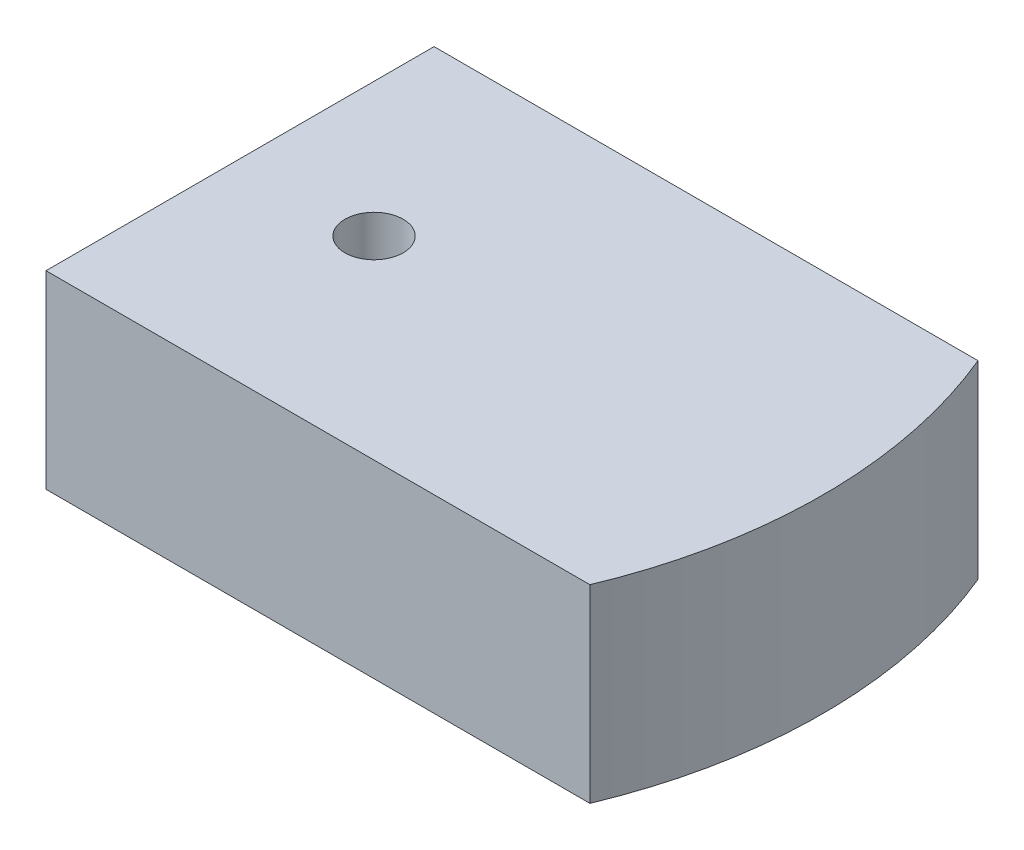
ISO-10303-21;
HEADER;
FILE_DESCRIPTION(('STEP AP214'),'2;1');
FILE_NAME('part.step','',(''),(''),'','','');
FILE_SCHEMA(('AUTOMOTIVE_DESIGN { 1 0 10303 214 1 1 1 1 }'));
ENDSEC;
DATA;
#1=APPLICATION_CONTEXT('core data for automotive mechanical design processes');
#2=APPLICATION_PROTOCOL_DEFINITION('international standard','automotive_design',2000,#1);
#3=PRODUCT_CONTEXT('',#1,'mechanical');
#4=PRODUCT('Part','Part','',(#3));
#5=PRODUCT_RELATED_PRODUCT_CATEGORY('part','',(#4));
#6=PRODUCT_DEFINITION_FORMATION('','',#4);
#7=PRODUCT_DEFINITION_CONTEXT('part definition',#1,'design');
#8=PRODUCT_DEFINITION('design','',#6,#7);
#9=PRODUCT_DEFINITION_SHAPE('','',#8);
#10=(LENGTH_UNIT() NAMED_UNIT(*) SI_UNIT(.MILLI.,.METRE.));
#11=(NAMED_UNIT(*) PLANE_ANGLE_UNIT() SI_UNIT($,.RADIAN.));
#12=(NAMED_UNIT(*) SI_UNIT($,.STERADIAN.) SOLID_ANGLE_UNIT());
#13=UNCERTAINTY_MEASURE_WITH_UNIT(LENGTH_MEASURE(1.E-05),#10,'distance_accuracy_value','');
#14=(GEOMETRIC_REPRESENTATION_CONTEXT(3) GLOBAL_UNCERTAINTY_ASSIGNED_CONTEXT((#13)) GLOBAL_UNIT_ASSIGNED_CONTEXT((#10,
#11,#12)) REPRESENTATION_CONTEXT('',''));
#15=CARTESIAN_POINT('',(0.,0.,0.));
#16=DIRECTION('',(0.,0.,1.));
#17=DIRECTION('',(1.,0.,0.));
#18=AXIS2_PLACEMENT_3D('',#15,#16,#17);
#19=CARTESIAN_POINT('',(3.39004314713801,8.255,0.));
#20=DIRECTION('',(0.,-1.,0.));
#21=DIRECTION('',(0.,0.,-1.));
#22=AXIS2_PLACEMENT_3D('',#19,#20,#21);
#23=PLANE('',#22);
#24=DIRECTION('',(0.,0.,1.));
#25=VECTOR('',#24,1.);
#26=CARTESIAN_POINT('',(0.,8.255,-8.4582));
#27=LINE('',#26,#25);
#28=CARTESIAN_POINT('',(0.,8.255,-8.4582));
#29=VERTEX_POINT('',#28);
#30=CARTESIAN_POINT('',(0.,8.255,8.4582));
#31=VERTEX_POINT('',#30);
#32=EDGE_CURVE('E86',#29,#31,#27,.T.);
#33=ORIENTED_EDGE('',*,*,#32,.T.);
#34=DIRECTION('',(1.,0.,0.));
#35=VECTOR('',#34,1.);
#36=CARTESIAN_POINT('',(0.,8.255,8.4582));
#37=LINE('',#36,#35);
#38=CARTESIAN_POINT('',(23.7099115872841,8.255,8.4582));
#39=VERTEX_POINT('',#38);
#40=EDGE_CURVE('E81',#31,#39,#37,.T.);
#41=ORIENTED_EDGE('',*,*,#40,.T.);
#42=CARTESIAN_POINT('',(3.39004314713801,8.255,0.));
#43=DIRECTION('',(0.,1.,0.));
#44=DIRECTION('',(0.,0.,-1.));
#45=AXIS2_PLACEMENT_3D('',#42,#43,#44);
#46=CIRCLE('',#45,22.009956852862);
#47=CARTESIAN_POINT('',(23.7099115872841,8.255,-8.4582));
#48=VERTEX_POINT('',#47);
#49=EDGE_CURVE('E84',#39,#48,#46,.T.);
#50=ORIENTED_EDGE('',*,*,#49,.T.);
#51=DIRECTION('',(-1.,0.,0.));
#52=VECTOR('',#51,1.);
#53=CARTESIAN_POINT('',(0.,8.255,-8.4582));
#54=LINE('',#53,#52);
#55=EDGE_CURVE('E51',#48,#29,#54,.T.);
#56=ORIENTED_EDGE('',*,*,#55,.T.);
#57=EDGE_LOOP('',(#33,#41,#50,#56));
#58=FACE_BOUND('',#57,.T.);
#59=CARTESIAN_POINT('',(5.842,8.255,0.));
#60=DIRECTION('',(0.,1.,0.));
#61=DIRECTION('',(0.,0.,1.));
#62=AXIS2_PLACEMENT_3D('',#59,#60,#61);
#63=CIRCLE('',#62,1.27);
#64=CARTESIAN_POINT('',(5.842,8.255,1.27));
#65=VERTEX_POINT('',#64);
#66=EDGE_CURVE('E101',#65,#65,#63,.T.);
#67=ORIENTED_EDGE('',*,*,#66,.F.);
#68=EDGE_LOOP('',(#67));
#69=FACE_BOUND('',#68,.T.);
#70=ADVANCED_FACE('F34',(#58,#69),#23,.F.);
#71=CARTESIAN_POINT('',(3.39004314713801,0.,0.));
#72=DIRECTION('',(0.,-1.,0.));
#73=DIRECTION('',(0.,0.,-1.));
#74=AXIS2_PLACEMENT_3D('',#71,#72,#73);
#75=PLANE('',#74);
#76=DIRECTION('',(0.,0.,1.));
#77=VECTOR('',#76,1.);
#78=CARTESIAN_POINT('',(0.,0.,-8.4582));
#79=LINE('',#78,#77);
#80=CARTESIAN_POINT('',(0.,0.,-8.4582));
#81=VERTEX_POINT('',#80);
#82=CARTESIAN_POINT('',(0.,0.,8.4582));
#83=VERTEX_POINT('',#82);
#84=EDGE_CURVE('E98',#81,#83,#79,.T.);
#85=ORIENTED_EDGE('',*,*,#84,.F.);
#86=DIRECTION('',(-1.,0.,0.));
#87=VECTOR('',#86,1.);
#88=CARTESIAN_POINT('',(0.,0.,-8.4582));
#89=LINE('',#88,#87);
#90=CARTESIAN_POINT('',(23.7099115872841,0.,-8.4582));
#91=VERTEX_POINT('',#90);
#92=EDGE_CURVE('E74',#91,#81,#89,.T.);
#93=ORIENTED_EDGE('',*,*,#92,.F.);
#94=CARTESIAN_POINT('',(3.39004314713801,0.,0.));
#95=DIRECTION('',(0.,1.,0.));
#96=DIRECTION('',(0.,0.,-1.));
#97=AXIS2_PLACEMENT_3D('',#94,#95,#96);
#98=CIRCLE('',#97,22.009956852862);
#99=CARTESIAN_POINT('',(23.7099115872841,0.,8.4582));
#100=VERTEX_POINT('',#99);
#101=EDGE_CURVE('E68',#100,#91,#98,.T.);
#102=ORIENTED_EDGE('',*,*,#101,.F.);
#103=DIRECTION('',(1.,0.,0.));
#104=VECTOR('',#103,1.);
#105=CARTESIAN_POINT('',(0.,0.,8.4582));
#106=LINE('',#105,#104);
#107=EDGE_CURVE('E90',#83,#100,#106,.T.);
#108=ORIENTED_EDGE('',*,*,#107,.F.);
#109=EDGE_LOOP('',(#85,#93,#102,#108));
#110=FACE_BOUND('',#109,.T.);
#111=CARTESIAN_POINT('',(5.842,0.,0.));
#112=DIRECTION('',(0.,1.,0.));
#113=DIRECTION('',(0.,0.,1.));
#114=AXIS2_PLACEMENT_3D('',#111,#112,#113);
#115=CIRCLE('',#114,1.27);
#116=CARTESIAN_POINT('',(5.842,0.,1.27));
#117=VERTEX_POINT('',#116);
#118=EDGE_CURVE('E113',#117,#117,#115,.T.);
#119=ORIENTED_EDGE('',*,*,#118,.T.);
#120=EDGE_LOOP('',(#119));
#121=FACE_BOUND('',#120,.T.);
#122=ADVANCED_FACE('F109',(#110,#121),#75,.T.);
#123=CARTESIAN_POINT('',(0.,8.255,-8.4582));
#124=DIRECTION('',(1.,0.,0.));
#125=DIRECTION('',(0.,0.,-1.));
#126=AXIS2_PLACEMENT_3D('',#123,#124,#125);
#127=PLANE('',#126);
#128=ORIENTED_EDGE('',*,*,#84,.T.);
#129=DIRECTION('',(0.,-1.,0.));
#130=VECTOR('',#129,1.);
#131=CARTESIAN_POINT('',(0.,8.255,8.4582));
#132=LINE('',#131,#130);
#133=EDGE_CURVE('E11',#31,#83,#132,.T.);
#134=ORIENTED_EDGE('',*,*,#133,.F.);
#135=ORIENTED_EDGE('',*,*,#32,.F.);
#136=DIRECTION('',(0.,-1.,0.));
#137=VECTOR('',#136,1.);
#138=CARTESIAN_POINT('',(0.,8.255,-8.4582));
#139=LINE('',#138,#137);
#140=EDGE_CURVE('E94',#29,#81,#139,.T.);
#141=ORIENTED_EDGE('',*,*,#140,.T.);
#142=EDGE_LOOP('',(#128,#134,#135,#141));
#143=FACE_BOUND('',#142,.T.);
#144=ADVANCED_FACE('F36',(#143),#127,.F.);
#145=CARTESIAN_POINT('',(0.,8.255,8.4582));
#146=DIRECTION('',(0.,0.,-1.));
#147=DIRECTION('',(-1.,0.,0.));
#148=AXIS2_PLACEMENT_3D('',#145,#146,#147);
#149=PLANE('',#148);
#150=ORIENTED_EDGE('',*,*,#107,.T.);
#151=DIRECTION('',(0.,-1.,0.));
#152=VECTOR('',#151,1.);
#153=CARTESIAN_POINT('',(23.7099115872841,8.255,8.4582));
#154=LINE('',#153,#152);
#155=EDGE_CURVE('E43',#39,#100,#154,.T.);
#156=ORIENTED_EDGE('',*,*,#155,.F.);
#157=ORIENTED_EDGE('',*,*,#40,.F.);
#158=ORIENTED_EDGE('',*,*,#133,.T.);
#159=EDGE_LOOP('',(#150,#156,#157,#158));
#160=FACE_BOUND('',#159,.T.);
#161=ADVANCED_FACE('F89',(#160),#149,.F.);
#162=CARTESIAN_POINT('',(3.39004314713801,8.255,0.));
#163=DIRECTION('',(0.,-1.,0.));
#164=DIRECTION('',(0.,0.,-1.));
#165=AXIS2_PLACEMENT_3D('',#162,#163,#164);
#166=CYLINDRICAL_SURFACE('',#165,22.009956852862);
#167=ORIENTED_EDGE('',*,*,#101,.T.);
#168=DIRECTION('',(0.,-1.,0.));
#169=VECTOR('',#168,1.);
#170=CARTESIAN_POINT('',(23.7099115872841,8.255,-8.4582));
#171=LINE('',#170,#169);
#172=EDGE_CURVE('E91',#48,#91,#171,.T.);
#173=ORIENTED_EDGE('',*,*,#172,.F.);
#174=ORIENTED_EDGE('',*,*,#49,.F.);
#175=ORIENTED_EDGE('',*,*,#155,.T.);
#176=EDGE_LOOP('',(#167,#173,#174,#175));
#177=FACE_BOUND('',#176,.T.);
#178=ADVANCED_FACE('F92',(#177),#166,.T.);
#179=CARTESIAN_POINT('',(0.,8.255,-8.4582));
#180=DIRECTION('',(0.,0.,1.));
#181=DIRECTION('',(1.,0.,0.));
#182=AXIS2_PLACEMENT_3D('',#179,#180,#181);
#183=PLANE('',#182);
#184=ORIENTED_EDGE('',*,*,#92,.T.);
#185=ORIENTED_EDGE('',*,*,#140,.F.);
#186=ORIENTED_EDGE('',*,*,#55,.F.);
#187=ORIENTED_EDGE('',*,*,#172,.T.);
#188=EDGE_LOOP('',(#184,#185,#186,#187));
#189=FACE_BOUND('',#188,.T.);
#190=ADVANCED_FACE('F106',(#189),#183,.F.);
#191=CARTESIAN_POINT('',(5.842,8.255,0.));
#192=DIRECTION('',(0.,-1.,0.));
#193=DIRECTION('',(0.,0.,-1.));
#194=AXIS2_PLACEMENT_3D('',#191,#192,#193);
#195=CYLINDRICAL_SURFACE('',#194,1.27);
#196=ORIENTED_EDGE('',*,*,#66,.T.);
#197=EDGE_LOOP('',(#196));
#198=FACE_BOUND('',#197,.T.);
#199=ORIENTED_EDGE('',*,*,#118,.F.);
#200=EDGE_LOOP('',(#199));
#201=FACE_BOUND('',#200,.T.);
#202=ADVANCED_FACE('F119',(#198,#201),#195,.F.);
#203=CLOSED_SHELL('',(#70,#122,#144,#161,#178,#190,#202));
#204=MANIFOLD_SOLID_BREP('B2',#203);
#205=ADVANCED_BREP_SHAPE_REPRESENTATION('',(#18,#204),#14);
#206=SHAPE_DEFINITION_REPRESENTATION(#9,#205);
ENDSEC;
END-ISO-10303-21;
